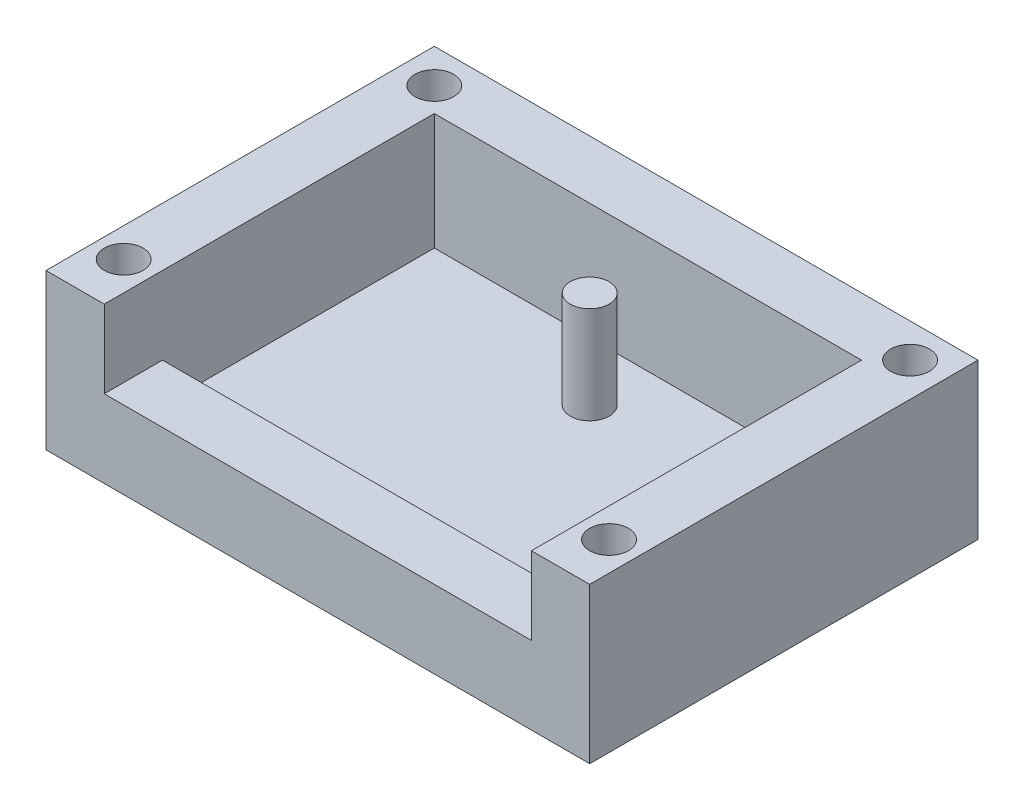
ISO-10303-21;
HEADER;
FILE_DESCRIPTION(('STEP AP214'),'2;1');
FILE_NAME('part.step','',(''),(''),'','','');
FILE_SCHEMA(('AUTOMOTIVE_DESIGN { 1 0 10303 214 1 1 1 1 }'));
ENDSEC;
DATA;
#1=APPLICATION_CONTEXT('core data for automotive mechanical design processes');
#2=APPLICATION_PROTOCOL_DEFINITION('international standard','automotive_design',2000,#1);
#3=PRODUCT_CONTEXT('',#1,'mechanical');
#4=PRODUCT('Part','Part','',(#3));
#5=PRODUCT_RELATED_PRODUCT_CATEGORY('part','',(#4));
#6=PRODUCT_DEFINITION_FORMATION('','',#4);
#7=PRODUCT_DEFINITION_CONTEXT('part definition',#1,'design');
#8=PRODUCT_DEFINITION('design','',#6,#7);
#9=PRODUCT_DEFINITION_SHAPE('','',#8);
#10=(LENGTH_UNIT() NAMED_UNIT(*) SI_UNIT(.MILLI.,.METRE.));
#11=(NAMED_UNIT(*) PLANE_ANGLE_UNIT() SI_UNIT($,.RADIAN.));
#12=(NAMED_UNIT(*) SI_UNIT($,.STERADIAN.) SOLID_ANGLE_UNIT());
#13=UNCERTAINTY_MEASURE_WITH_UNIT(LENGTH_MEASURE(1.E-05),#10,'distance_accuracy_value','');
#14=(GEOMETRIC_REPRESENTATION_CONTEXT(3) GLOBAL_UNCERTAINTY_ASSIGNED_CONTEXT((#13)) GLOBAL_UNIT_ASSIGNED_CONTEXT((#10,
#11,#12)) REPRESENTATION_CONTEXT('',''));
#15=CARTESIAN_POINT('',(0.,0.,0.));
#16=DIRECTION('',(0.,0.,1.));
#17=DIRECTION('',(1.,0.,0.));
#18=AXIS2_PLACEMENT_3D('',#15,#16,#17);
#19=CARTESIAN_POINT('',(-25.,2.,17.));
#20=DIRECTION('',(0.,0.,1.));
#21=DIRECTION('',(1.,0.,0.));
#22=AXIS2_PLACEMENT_3D('',#19,#20,#21);
#23=PLANE('',#22);
#24=DIRECTION('',(-1.,0.,0.));
#25=VECTOR('',#24,1.);
#26=CARTESIAN_POINT('',(-25.,4.,17.));
#27=LINE('',#26,#25);
#28=CARTESIAN_POINT('',(-3.,4.,17.));
#29=VERTEX_POINT('',#28);
#30=CARTESIAN_POINT('',(-25.,4.,17.));
#31=VERTEX_POINT('',#30);
#32=EDGE_CURVE('E130',#29,#31,#27,.T.);
#33=ORIENTED_EDGE('',*,*,#32,.F.);
#34=DIRECTION('',(0.,1.,0.));
#35=VECTOR('',#34,1.);
#36=CARTESIAN_POINT('',(-3.,2.,17.));
#37=LINE('',#36,#35);
#38=CARTESIAN_POINT('',(-3.,2.,17.));
#39=VERTEX_POINT('',#38);
#40=EDGE_CURVE('E163',#39,#29,#37,.T.);
#41=ORIENTED_EDGE('',*,*,#40,.F.);
#42=DIRECTION('',(1.,0.,0.));
#43=VECTOR('',#42,1.);
#44=CARTESIAN_POINT('',(-25.,2.,17.));
#45=LINE('',#44,#43);
#46=CARTESIAN_POINT('',(-25.,2.,17.));
#47=VERTEX_POINT('',#46);
#48=EDGE_CURVE('E151',#47,#39,#45,.T.);
#49=ORIENTED_EDGE('',*,*,#48,.F.);
#50=DIRECTION('',(0.,1.,0.));
#51=VECTOR('',#50,1.);
#52=CARTESIAN_POINT('',(-25.,2.,17.));
#53=LINE('',#52,#51);
#54=EDGE_CURVE('E170',#47,#31,#53,.T.);
#55=ORIENTED_EDGE('',*,*,#54,.T.);
#56=EDGE_LOOP('',(#33,#41,#49,#55));
#57=FACE_BOUND('',#56,.T.);
#58=ADVANCED_FACE('F33',(#57),#23,.F.);
#59=CARTESIAN_POINT('',(0.,8.,0.));
#60=DIRECTION('',(-1.,0.,0.));
#61=DIRECTION('',(0.,0.,1.));
#62=AXIS2_PLACEMENT_3D('',#59,#60,#61);
#63=PLANE('',#62);
#64=DIRECTION('',(0.,0.,-1.));
#65=VECTOR('',#64,1.);
#66=CARTESIAN_POINT('',(0.,0.,0.));
#67=LINE('',#66,#65);
#68=CARTESIAN_POINT('',(0.,0.,20.));
#69=VERTEX_POINT('',#68);
#70=CARTESIAN_POINT('',(0.,0.,0.));
#71=VERTEX_POINT('',#70);
#72=EDGE_CURVE('E172',#69,#71,#67,.T.);
#73=ORIENTED_EDGE('',*,*,#72,.T.);
#74=DIRECTION('',(0.,-1.,0.));
#75=VECTOR('',#74,1.);
#76=CARTESIAN_POINT('',(0.,8.,0.));
#77=LINE('',#76,#75);
#78=CARTESIAN_POINT('',(0.,8.,0.));
#79=VERTEX_POINT('',#78);
#80=EDGE_CURVE('E11',#79,#71,#77,.T.);
#81=ORIENTED_EDGE('',*,*,#80,.F.);
#82=DIRECTION('',(0.,0.,-1.));
#83=VECTOR('',#82,1.);
#84=CARTESIAN_POINT('',(0.,8.,0.));
#85=LINE('',#84,#83);
#86=CARTESIAN_POINT('',(0.,8.,20.));
#87=VERTEX_POINT('',#86);
#88=EDGE_CURVE('E179',#87,#79,#85,.T.);
#89=ORIENTED_EDGE('',*,*,#88,.F.);
#90=DIRECTION('',(0.,-1.,0.));
#91=VECTOR('',#90,1.);
#92=CARTESIAN_POINT('',(0.,8.,20.));
#93=LINE('',#92,#91);
#94=EDGE_CURVE('E186',#87,#69,#93,.T.);
#95=ORIENTED_EDGE('',*,*,#94,.T.);
#96=EDGE_LOOP('',(#73,#81,#89,#95));
#97=FACE_BOUND('',#96,.T.);
#98=ADVANCED_FACE('F35',(#97),#63,.F.);
#99=CARTESIAN_POINT('',(0.,8.,0.));
#100=DIRECTION('',(0.,0.,1.));
#101=DIRECTION('',(1.,0.,0.));
#102=AXIS2_PLACEMENT_3D('',#99,#100,#101);
#103=PLANE('',#102);
#104=DIRECTION('',(-1.,0.,0.));
#105=VECTOR('',#104,1.);
#106=CARTESIAN_POINT('',(0.,0.,0.));
#107=LINE('',#106,#105);
#108=CARTESIAN_POINT('',(-28.,0.,0.));
#109=VERTEX_POINT('',#108);
#110=EDGE_CURVE('E189',#71,#109,#107,.T.);
#111=ORIENTED_EDGE('',*,*,#110,.T.);
#112=DIRECTION('',(0.,-1.,0.));
#113=VECTOR('',#112,1.);
#114=CARTESIAN_POINT('',(-28.,8.,0.));
#115=LINE('',#114,#113);
#116=CARTESIAN_POINT('',(-28.,8.,0.));
#117=VERTEX_POINT('',#116);
#118=EDGE_CURVE('E42',#117,#109,#115,.T.);
#119=ORIENTED_EDGE('',*,*,#118,.F.);
#120=DIRECTION('',(-1.,0.,0.));
#121=VECTOR('',#120,1.);
#122=CARTESIAN_POINT('',(0.,8.,0.));
#123=LINE('',#122,#121);
#124=EDGE_CURVE('E82',#79,#117,#123,.T.);
#125=ORIENTED_EDGE('',*,*,#124,.F.);
#126=ORIENTED_EDGE('',*,*,#80,.T.);
#127=EDGE_LOOP('',(#111,#119,#125,#126));
#128=FACE_BOUND('',#127,.T.);
#129=ADVANCED_FACE('F233',(#128),#103,.F.);
#130=CARTESIAN_POINT('',(-28.,8.,0.));
#131=DIRECTION('',(1.,0.,0.));
#132=DIRECTION('',(0.,0.,-1.));
#133=AXIS2_PLACEMENT_3D('',#130,#131,#132);
#134=PLANE('',#133);
#135=DIRECTION('',(0.,0.,1.));
#136=VECTOR('',#135,1.);
#137=CARTESIAN_POINT('',(-28.,0.,0.));
#138=LINE('',#137,#136);
#139=CARTESIAN_POINT('',(-28.,0.,20.));
#140=VERTEX_POINT('',#139);
#141=EDGE_CURVE('E69',#109,#140,#138,.T.);
#142=ORIENTED_EDGE('',*,*,#141,.T.);
#143=DIRECTION('',(0.,-1.,0.));
#144=VECTOR('',#143,1.);
#145=CARTESIAN_POINT('',(-28.,8.,20.));
#146=LINE('',#145,#144);
#147=CARTESIAN_POINT('',(-28.,8.,20.));
#148=VERTEX_POINT('',#147);
#149=EDGE_CURVE('E194',#148,#140,#146,.T.);
#150=ORIENTED_EDGE('',*,*,#149,.F.);
#151=DIRECTION('',(0.,0.,1.));
#152=VECTOR('',#151,1.);
#153=CARTESIAN_POINT('',(-28.,8.,0.));
#154=LINE('',#153,#152);
#155=EDGE_CURVE('E182',#117,#148,#154,.T.);
#156=ORIENTED_EDGE('',*,*,#155,.F.);
#157=ORIENTED_EDGE('',*,*,#118,.T.);
#158=EDGE_LOOP('',(#142,#150,#156,#157));
#159=FACE_BOUND('',#158,.T.);
#160=ADVANCED_FACE('F196',(#159),#134,.F.);
#161=CARTESIAN_POINT('',(0.,8.,20.));
#162=DIRECTION('',(0.,0.,-1.));
#163=DIRECTION('',(-1.,0.,0.));
#164=AXIS2_PLACEMENT_3D('',#161,#162,#163);
#165=PLANE('',#164);
#166=DIRECTION('',(1.,0.,0.));
#167=VECTOR('',#166,1.);
#168=CARTESIAN_POINT('',(-25.,4.,20.));
#169=LINE('',#168,#167);
#170=CARTESIAN_POINT('',(-25.,4.,20.));
#171=VERTEX_POINT('',#170);
#172=CARTESIAN_POINT('',(-3.,4.,20.));
#173=VERTEX_POINT('',#172);
#174=EDGE_CURVE('E135',#171,#173,#169,.T.);
#175=ORIENTED_EDGE('',*,*,#174,.F.);
#176=DIRECTION('',(0.,1.,0.));
#177=VECTOR('',#176,1.);
#178=CARTESIAN_POINT('',(-25.,4.,20.));
#179=LINE('',#178,#177);
#180=CARTESIAN_POINT('',(-25.,8.,20.));
#181=VERTEX_POINT('',#180);
#182=EDGE_CURVE('E119',#171,#181,#179,.T.);
#183=ORIENTED_EDGE('',*,*,#182,.T.);
#184=DIRECTION('',(1.,0.,0.));
#185=VECTOR('',#184,1.);
#186=CARTESIAN_POINT('',(0.,8.,20.));
#187=LINE('',#186,#185);
#188=EDGE_CURVE('E184',#148,#181,#187,.T.);
#189=ORIENTED_EDGE('',*,*,#188,.F.);
#190=ORIENTED_EDGE('',*,*,#149,.T.);
#191=DIRECTION('',(1.,0.,0.));
#192=VECTOR('',#191,1.);
#193=CARTESIAN_POINT('',(0.,0.,20.));
#194=LINE('',#193,#192);
#195=EDGE_CURVE('E75',#140,#69,#194,.T.);
#196=ORIENTED_EDGE('',*,*,#195,.T.);
#197=ORIENTED_EDGE('',*,*,#94,.F.);
#198=CARTESIAN_POINT('',(-3.,8.,20.));
#199=VERTEX_POINT('',#198);
#200=EDGE_CURVE('E50',#199,#87,#187,.T.);
#201=ORIENTED_EDGE('',*,*,#200,.F.);
#202=DIRECTION('',(0.,1.,0.));
#203=VECTOR('',#202,1.);
#204=CARTESIAN_POINT('',(-3.,4.,20.));
#205=LINE('',#204,#203);
#206=EDGE_CURVE('E129',#173,#199,#205,.T.);
#207=ORIENTED_EDGE('',*,*,#206,.F.);
#208=EDGE_LOOP('',(#175,#183,#189,#190,#196,#197,#201,#207));
#209=FACE_BOUND('',#208,.T.);
#210=ADVANCED_FACE('F141',(#209),#165,.F.);
#211=CARTESIAN_POINT('',(0.,8.,0.));
#212=DIRECTION('',(0.,-1.,0.));
#213=DIRECTION('',(0.,0.,-1.));
#214=AXIS2_PLACEMENT_3D('',#211,#212,#213);
#215=PLANE('',#214);
#216=CARTESIAN_POINT('',(-1.5,8.,17.5));
#217=DIRECTION('',(0.,-1.,0.));
#218=DIRECTION('',(0.,0.,1.));
#219=AXIS2_PLACEMENT_3D('',#216,#217,#218);
#220=CIRCLE('',#219,1.);
#221=CARTESIAN_POINT('',(-1.5,8.,18.5));
#222=VERTEX_POINT('',#221);
#223=EDGE_CURVE('E400',#222,#222,#220,.T.);
#224=ORIENTED_EDGE('',*,*,#223,.T.);
#225=EDGE_LOOP('',(#224));
#226=FACE_BOUND('',#225,.T.);
#227=CARTESIAN_POINT('',(-26.5,8.,17.5));
#228=DIRECTION('',(0.,1.,0.));
#229=DIRECTION('',(0.,0.,1.));
#230=AXIS2_PLACEMENT_3D('',#227,#228,#229);
#231=CIRCLE('',#230,1.);
#232=CARTESIAN_POINT('',(-26.5,8.,18.5));
#233=VERTEX_POINT('',#232);
#234=EDGE_CURVE('E399',#233,#233,#231,.T.);
#235=ORIENTED_EDGE('',*,*,#234,.F.);
#236=EDGE_LOOP('',(#235));
#237=FACE_BOUND('',#236,.T.);
#238=CARTESIAN_POINT('',(-1.75,8.,1.75));
#239=DIRECTION('',(0.,-1.,0.));
#240=DIRECTION('',(0.,0.,1.));
#241=AXIS2_PLACEMENT_3D('',#238,#239,#240);
#242=CIRCLE('',#241,1.);
#243=CARTESIAN_POINT('',(-1.75,8.,2.75));
#244=VERTEX_POINT('',#243);
#245=EDGE_CURVE('E409',#244,#244,#242,.T.);
#246=ORIENTED_EDGE('',*,*,#245,.T.);
#247=EDGE_LOOP('',(#246));
#248=FACE_BOUND('',#247,.T.);
#249=CARTESIAN_POINT('',(-26.25,8.,1.75));
#250=DIRECTION('',(0.,1.,0.));
#251=DIRECTION('',(0.,0.,1.));
#252=AXIS2_PLACEMENT_3D('',#249,#250,#251);
#253=CIRCLE('',#252,1.);
#254=CARTESIAN_POINT('',(-26.25,8.,2.75));
#255=VERTEX_POINT('',#254);
#256=EDGE_CURVE('E414',#255,#255,#253,.T.);
#257=ORIENTED_EDGE('',*,*,#256,.F.);
#258=EDGE_LOOP('',(#257));
#259=FACE_BOUND('',#258,.T.);
#260=ORIENTED_EDGE('',*,*,#188,.T.);
#261=DIRECTION('',(0.,0.,1.));
#262=VECTOR('',#261,1.);
#263=CARTESIAN_POINT('',(-25.,8.,3.));
#264=LINE('',#263,#262);
#265=CARTESIAN_POINT('',(-25.,8.,3.));
#266=VERTEX_POINT('',#265);
#267=EDGE_CURVE('E125',#266,#181,#264,.T.);
#268=ORIENTED_EDGE('',*,*,#267,.F.);
#269=DIRECTION('',(-1.,0.,0.));
#270=VECTOR('',#269,1.);
#271=CARTESIAN_POINT('',(-3.,8.,3.));
#272=LINE('',#271,#270);
#273=CARTESIAN_POINT('',(-3.,8.,3.));
#274=VERTEX_POINT('',#273);
#275=EDGE_CURVE('E166',#274,#266,#272,.T.);
#276=ORIENTED_EDGE('',*,*,#275,.F.);
#277=DIRECTION('',(0.,0.,-1.));
#278=VECTOR('',#277,1.);
#279=CARTESIAN_POINT('',(-3.,8.,17.));
#280=LINE('',#279,#278);
#281=EDGE_CURVE('E149',#199,#274,#280,.T.);
#282=ORIENTED_EDGE('',*,*,#281,.F.);
#283=ORIENTED_EDGE('',*,*,#200,.T.);
#284=ORIENTED_EDGE('',*,*,#88,.T.);
#285=ORIENTED_EDGE('',*,*,#124,.T.);
#286=ORIENTED_EDGE('',*,*,#155,.T.);
#287=EDGE_LOOP('',(#260,#268,#276,#282,#283,#284,#285,#286));
#288=FACE_BOUND('',#287,.T.);
#289=ADVANCED_FACE('F203',(#226,#237,#248,#259,#288),#215,.F.);
#290=CARTESIAN_POINT('',(0.,0.,0.));
#291=DIRECTION('',(0.,-1.,0.));
#292=DIRECTION('',(0.,0.,-1.));
#293=AXIS2_PLACEMENT_3D('',#290,#291,#292);
#294=PLANE('',#293);
#295=ORIENTED_EDGE('',*,*,#72,.F.);
#296=ORIENTED_EDGE('',*,*,#195,.F.);
#297=ORIENTED_EDGE('',*,*,#141,.F.);
#298=ORIENTED_EDGE('',*,*,#110,.F.);
#299=EDGE_LOOP('',(#295,#296,#297,#298));
#300=FACE_BOUND('',#299,.T.);
#301=ADVANCED_FACE('F199',(#300),#294,.T.);
#302=CARTESIAN_POINT('',(-25.,2.,3.));
#303=DIRECTION('',(-1.,0.,0.));
#304=DIRECTION('',(0.,0.,1.));
#305=AXIS2_PLACEMENT_3D('',#302,#303,#304);
#306=PLANE('',#305);
#307=ORIENTED_EDGE('',*,*,#267,.T.);
#308=ORIENTED_EDGE('',*,*,#182,.F.);
#309=DIRECTION('',(0.,0.,1.));
#310=VECTOR('',#309,1.);
#311=CARTESIAN_POINT('',(-25.,4.,17.));
#312=LINE('',#311,#310);
#313=EDGE_CURVE('E122',#31,#171,#312,.T.);
#314=ORIENTED_EDGE('',*,*,#313,.F.);
#315=ORIENTED_EDGE('',*,*,#54,.F.);
#316=DIRECTION('',(0.,0.,1.));
#317=VECTOR('',#316,1.);
#318=CARTESIAN_POINT('',(-25.,2.,3.));
#319=LINE('',#318,#317);
#320=CARTESIAN_POINT('',(-25.,2.,3.));
#321=VERTEX_POINT('',#320);
#322=EDGE_CURVE('E160',#321,#47,#319,.T.);
#323=ORIENTED_EDGE('',*,*,#322,.F.);
#324=DIRECTION('',(0.,1.,0.));
#325=VECTOR('',#324,1.);
#326=CARTESIAN_POINT('',(-25.,2.,3.));
#327=LINE('',#326,#325);
#328=EDGE_CURVE('E173',#321,#266,#327,.T.);
#329=ORIENTED_EDGE('',*,*,#328,.T.);
#330=EDGE_LOOP('',(#307,#308,#314,#315,#323,#329));
#331=FACE_BOUND('',#330,.T.);
#332=ADVANCED_FACE('F121',(#331),#306,.F.);
#333=CARTESIAN_POINT('',(-3.,2.,3.));
#334=DIRECTION('',(0.,0.,-1.));
#335=DIRECTION('',(-1.,0.,0.));
#336=AXIS2_PLACEMENT_3D('',#333,#334,#335);
#337=PLANE('',#336);
#338=ORIENTED_EDGE('',*,*,#275,.T.);
#339=ORIENTED_EDGE('',*,*,#328,.F.);
#340=DIRECTION('',(-1.,0.,0.));
#341=VECTOR('',#340,1.);
#342=CARTESIAN_POINT('',(-3.,2.,3.));
#343=LINE('',#342,#341);
#344=CARTESIAN_POINT('',(-3.,2.,3.));
#345=VERTEX_POINT('',#344);
#346=EDGE_CURVE('E157',#345,#321,#343,.T.);
#347=ORIENTED_EDGE('',*,*,#346,.F.);
#348=DIRECTION('',(0.,1.,0.));
#349=VECTOR('',#348,1.);
#350=CARTESIAN_POINT('',(-3.,2.,3.));
#351=LINE('',#350,#349);
#352=EDGE_CURVE('E175',#345,#274,#351,.T.);
#353=ORIENTED_EDGE('',*,*,#352,.T.);
#354=EDGE_LOOP('',(#338,#339,#347,#353));
#355=FACE_BOUND('',#354,.T.);
#356=ADVANCED_FACE('F206',(#355),#337,.F.);
#357=CARTESIAN_POINT('',(-3.,2.,17.));
#358=DIRECTION('',(1.,0.,0.));
#359=DIRECTION('',(0.,0.,-1.));
#360=AXIS2_PLACEMENT_3D('',#357,#358,#359);
#361=PLANE('',#360);
#362=ORIENTED_EDGE('',*,*,#281,.T.);
#363=ORIENTED_EDGE('',*,*,#352,.F.);
#364=DIRECTION('',(0.,0.,-1.));
#365=VECTOR('',#364,1.);
#366=CARTESIAN_POINT('',(-3.,2.,17.));
#367=LINE('',#366,#365);
#368=EDGE_CURVE('E154',#39,#345,#367,.T.);
#369=ORIENTED_EDGE('',*,*,#368,.F.);
#370=ORIENTED_EDGE('',*,*,#40,.T.);
#371=DIRECTION('',(0.,0.,-1.));
#372=VECTOR('',#371,1.);
#373=CARTESIAN_POINT('',(-3.,4.,17.));
#374=LINE('',#373,#372);
#375=EDGE_CURVE('E143',#173,#29,#374,.T.);
#376=ORIENTED_EDGE('',*,*,#375,.F.);
#377=ORIENTED_EDGE('',*,*,#206,.T.);
#378=EDGE_LOOP('',(#362,#363,#369,#370,#376,#377));
#379=FACE_BOUND('',#378,.T.);
#380=ADVANCED_FACE('F210',(#379),#361,.F.);
#381=CARTESIAN_POINT('',(0.,2.,0.));
#382=DIRECTION('',(0.,1.,0.));
#383=DIRECTION('',(0.,0.,1.));
#384=AXIS2_PLACEMENT_3D('',#381,#382,#383);
#385=PLANE('',#384);
#386=CARTESIAN_POINT('',(-14.,2.,6.));
#387=DIRECTION('',(0.,1.,0.));
#388=DIRECTION('',(0.,0.,1.));
#389=AXIS2_PLACEMENT_3D('',#386,#387,#388);
#390=CIRCLE('',#389,1.);
#391=CARTESIAN_POINT('',(-14.,2.,7.));
#392=VERTEX_POINT('',#391);
#393=EDGE_CURVE('E420',#392,#392,#390,.T.);
#394=ORIENTED_EDGE('',*,*,#393,.F.);
#395=EDGE_LOOP('',(#394));
#396=FACE_BOUND('',#395,.T.);
#397=ORIENTED_EDGE('',*,*,#48,.T.);
#398=ORIENTED_EDGE('',*,*,#368,.T.);
#399=ORIENTED_EDGE('',*,*,#346,.T.);
#400=ORIENTED_EDGE('',*,*,#322,.T.);
#401=EDGE_LOOP('',(#397,#398,#399,#400));
#402=FACE_BOUND('',#401,.T.);
#403=ADVANCED_FACE('F215',(#396,#402),#385,.T.);
#404=CARTESIAN_POINT('',(0.,4.,0.));
#405=DIRECTION('',(0.,1.,0.));
#406=DIRECTION('',(0.,0.,1.));
#407=AXIS2_PLACEMENT_3D('',#404,#405,#406);
#408=PLANE('',#407);
#409=ORIENTED_EDGE('',*,*,#313,.T.);
#410=ORIENTED_EDGE('',*,*,#174,.T.);
#411=ORIENTED_EDGE('',*,*,#375,.T.);
#412=ORIENTED_EDGE('',*,*,#32,.T.);
#413=EDGE_LOOP('',(#409,#410,#411,#412));
#414=FACE_BOUND('',#413,.T.);
#415=ADVANCED_FACE('F134',(#414),#408,.T.);
#416=CARTESIAN_POINT('',(-14.,7.,6.));
#417=DIRECTION('',(0.,-1.,0.));
#418=DIRECTION('',(0.,0.,-1.));
#419=AXIS2_PLACEMENT_3D('',#416,#417,#418);
#420=CYLINDRICAL_SURFACE('',#419,1.);
#421=CARTESIAN_POINT('',(-14.,7.,6.));
#422=DIRECTION('',(0.,1.,0.));
#423=DIRECTION('',(0.,0.,1.));
#424=AXIS2_PLACEMENT_3D('',#421,#422,#423);
#425=CIRCLE('',#424,1.);
#426=CARTESIAN_POINT('',(-14.,7.,7.));
#427=VERTEX_POINT('',#426);
#428=EDGE_CURVE('E139',#427,#427,#425,.T.);
#429=ORIENTED_EDGE('',*,*,#428,.F.);
#430=EDGE_LOOP('',(#429));
#431=FACE_BOUND('',#430,.T.);
#432=ORIENTED_EDGE('',*,*,#393,.T.);
#433=EDGE_LOOP('',(#432));
#434=FACE_BOUND('',#433,.T.);
#435=ADVANCED_FACE('F223',(#431,#434),#420,.T.);
#436=CARTESIAN_POINT('',(-14.,7.,6.));
#437=DIRECTION('',(0.,1.,0.));
#438=DIRECTION('',(0.,0.,1.));
#439=AXIS2_PLACEMENT_3D('',#436,#437,#438);
#440=PLANE('',#439);
#441=ORIENTED_EDGE('',*,*,#428,.T.);
#442=EDGE_LOOP('',(#441));
#443=FACE_BOUND('',#442,.T.);
#444=ADVANCED_FACE('F304',(#443),#440,.T.);
#445=CARTESIAN_POINT('',(-26.25,6.,1.75));
#446=DIRECTION('',(0.,1.,0.));
#447=DIRECTION('',(0.,0.,1.));
#448=AXIS2_PLACEMENT_3D('',#445,#446,#447);
#449=CYLINDRICAL_SURFACE('',#448,1.);
#450=CARTESIAN_POINT('',(-26.25,6.,1.75));
#451=DIRECTION('',(0.,1.,0.));
#452=DIRECTION('',(0.,0.,1.));
#453=AXIS2_PLACEMENT_3D('',#450,#451,#452);
#454=CIRCLE('',#453,1.);
#455=CARTESIAN_POINT('',(-26.25,6.,2.75));
#456=VERTEX_POINT('',#455);
#457=EDGE_CURVE('E417',#456,#456,#454,.T.);
#458=ORIENTED_EDGE('',*,*,#457,.F.);
#459=EDGE_LOOP('',(#458));
#460=FACE_BOUND('',#459,.T.);
#461=ORIENTED_EDGE('',*,*,#256,.T.);
#462=EDGE_LOOP('',(#461));
#463=FACE_BOUND('',#462,.T.);
#464=ADVANCED_FACE('F314',(#460,#463),#449,.F.);
#465=CARTESIAN_POINT('',(-26.25,6.,1.75));
#466=DIRECTION('',(0.,1.,0.));
#467=DIRECTION('',(0.,0.,1.));
#468=AXIS2_PLACEMENT_3D('',#465,#466,#467);
#469=PLANE('',#468);
#470=ORIENTED_EDGE('',*,*,#457,.T.);
#471=EDGE_LOOP('',(#470));
#472=FACE_BOUND('',#471,.T.);
#473=ADVANCED_FACE('F324',(#472),#469,.T.);
#474=CARTESIAN_POINT('',(-1.75,6.,1.75));
#475=DIRECTION('',(0.,1.,0.));
#476=DIRECTION('',(0.,0.,1.));
#477=AXIS2_PLACEMENT_3D('',#474,#475,#476);
#478=CYLINDRICAL_SURFACE('',#477,1.);
#479=CARTESIAN_POINT('',(-1.75,6.,1.75));
#480=DIRECTION('',(0.,-1.,0.));
#481=DIRECTION('',(0.,0.,1.));
#482=AXIS2_PLACEMENT_3D('',#479,#480,#481);
#483=CIRCLE('',#482,1.);
#484=CARTESIAN_POINT('',(-1.75,6.,2.75));
#485=VERTEX_POINT('',#484);
#486=EDGE_CURVE('E411',#485,#485,#483,.T.);
#487=ORIENTED_EDGE('',*,*,#486,.T.);
#488=EDGE_LOOP('',(#487));
#489=FACE_BOUND('',#488,.T.);
#490=ORIENTED_EDGE('',*,*,#245,.F.);
#491=EDGE_LOOP('',(#490));
#492=FACE_BOUND('',#491,.T.);
#493=ADVANCED_FACE('F334',(#489,#492),#478,.F.);
#494=CARTESIAN_POINT('',(-1.75,6.,1.75));
#495=DIRECTION('',(0.,1.,0.));
#496=DIRECTION('',(0.,0.,1.));
#497=AXIS2_PLACEMENT_3D('',#494,#495,#496);
#498=PLANE('',#497);
#499=ORIENTED_EDGE('',*,*,#486,.F.);
#500=EDGE_LOOP('',(#499));
#501=FACE_BOUND('',#500,.T.);
#502=ADVANCED_FACE('F344',(#501),#498,.T.);
#503=CARTESIAN_POINT('',(-26.5,6.,17.5));
#504=DIRECTION('',(0.,1.,0.));
#505=DIRECTION('',(0.,0.,1.));
#506=AXIS2_PLACEMENT_3D('',#503,#504,#505);
#507=CYLINDRICAL_SURFACE('',#506,1.);
#508=CARTESIAN_POINT('',(-26.5,6.,17.5));
#509=DIRECTION('',(0.,1.,0.));
#510=DIRECTION('',(0.,0.,1.));
#511=AXIS2_PLACEMENT_3D('',#508,#509,#510);
#512=CIRCLE('',#511,1.);
#513=CARTESIAN_POINT('',(-26.5,6.,18.5));
#514=VERTEX_POINT('',#513);
#515=EDGE_CURVE('E403',#514,#514,#512,.T.);
#516=ORIENTED_EDGE('',*,*,#515,.F.);
#517=EDGE_LOOP('',(#516));
#518=FACE_BOUND('',#517,.T.);
#519=ORIENTED_EDGE('',*,*,#234,.T.);
#520=EDGE_LOOP('',(#519));
#521=FACE_BOUND('',#520,.T.);
#522=ADVANCED_FACE('F354',(#518,#521),#507,.F.);
#523=CARTESIAN_POINT('',(-26.5,6.,17.5));
#524=DIRECTION('',(0.,1.,0.));
#525=DIRECTION('',(0.,0.,1.));
#526=AXIS2_PLACEMENT_3D('',#523,#524,#525);
#527=PLANE('',#526);
#528=ORIENTED_EDGE('',*,*,#515,.T.);
#529=EDGE_LOOP('',(#528));
#530=FACE_BOUND('',#529,.T.);
#531=ADVANCED_FACE('F363',(#530),#527,.T.);
#532=CARTESIAN_POINT('',(-1.5,6.,17.5));
#533=DIRECTION('',(0.,1.,0.));
#534=DIRECTION('',(0.,0.,1.));
#535=AXIS2_PLACEMENT_3D('',#532,#533,#534);
#536=CYLINDRICAL_SURFACE('',#535,1.);
#537=CARTESIAN_POINT('',(-1.5,6.,17.5));
#538=DIRECTION('',(0.,-1.,0.));
#539=DIRECTION('',(0.,0.,1.));
#540=AXIS2_PLACEMENT_3D('',#537,#538,#539);
#541=CIRCLE('',#540,1.);
#542=CARTESIAN_POINT('',(-1.5,6.,18.5));
#543=VERTEX_POINT('',#542);
#544=EDGE_CURVE('E398',#543,#543,#541,.T.);
#545=ORIENTED_EDGE('',*,*,#544,.T.);
#546=EDGE_LOOP('',(#545));
#547=FACE_BOUND('',#546,.T.);
#548=ORIENTED_EDGE('',*,*,#223,.F.);
#549=EDGE_LOOP('',(#548));
#550=FACE_BOUND('',#549,.T.);
#551=ADVANCED_FACE('F372',(#547,#550),#536,.F.);
#552=CARTESIAN_POINT('',(-1.5,6.,17.5));
#553=DIRECTION('',(0.,1.,0.));
#554=DIRECTION('',(0.,0.,1.));
#555=AXIS2_PLACEMENT_3D('',#552,#553,#554);
#556=PLANE('',#555);
#557=ORIENTED_EDGE('',*,*,#544,.F.);
#558=EDGE_LOOP('',(#557));
#559=FACE_BOUND('',#558,.T.);
#560=ADVANCED_FACE('F382',(#559),#556,.T.);
#561=CLOSED_SHELL('',(#58,#98,#129,#160,#210,#289,#301,#332,#356,#380,#403,#415,#435,#444,#464,
#473,#493,#502,#522,#531,#551,#560));
#562=MANIFOLD_SOLID_BREP('B2',#561);
#563=ADVANCED_BREP_SHAPE_REPRESENTATION('',(#18,#562),#14);
#564=SHAPE_DEFINITION_REPRESENTATION(#9,#563);
ENDSEC;
END-ISO-10303-21;
